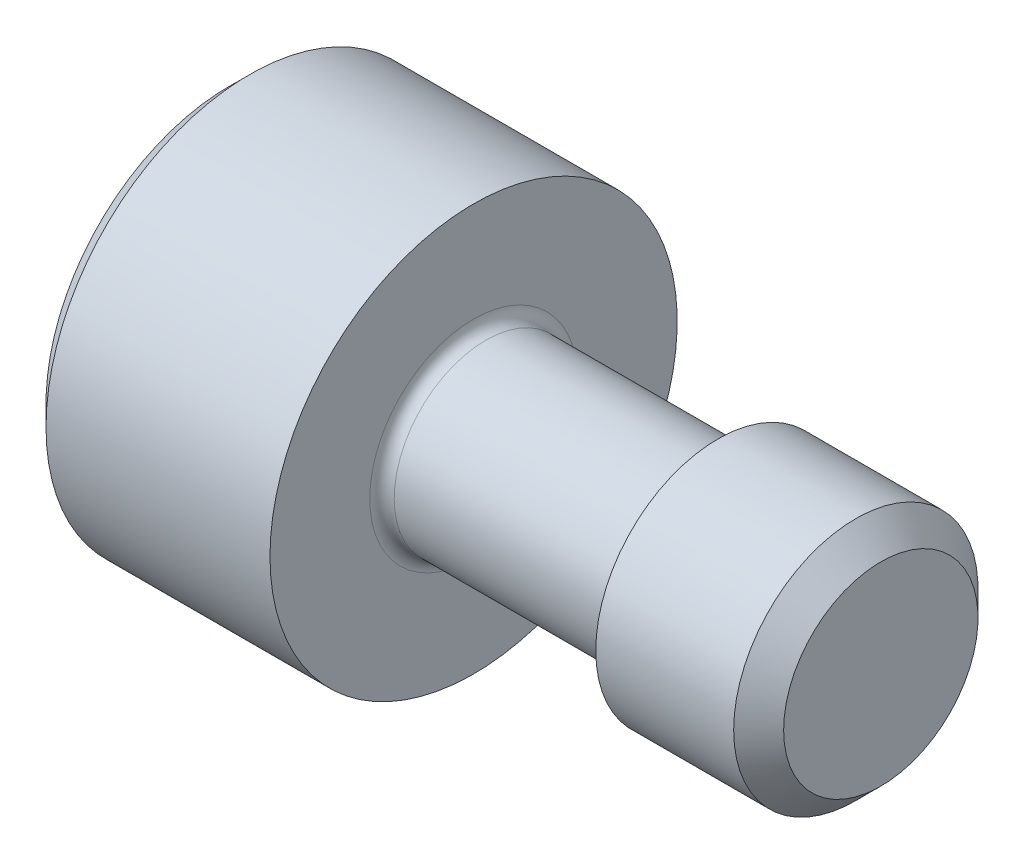
ISO-10303-21;
HEADER;
FILE_DESCRIPTION(('STEP AP214'),'2;1');
FILE_NAME('part.step','',(''),(''),'','','');
FILE_SCHEMA(('AUTOMOTIVE_DESIGN { 1 0 10303 214 1 1 1 1 }'));
ENDSEC;
DATA;
#1=APPLICATION_CONTEXT('core data for automotive mechanical design processes');
#2=APPLICATION_PROTOCOL_DEFINITION('international standard','automotive_design',2000,#1);
#3=PRODUCT_CONTEXT('',#1,'mechanical');
#4=PRODUCT('Part','Part','',(#3));
#5=PRODUCT_RELATED_PRODUCT_CATEGORY('part','',(#4));
#6=PRODUCT_DEFINITION_FORMATION('','',#4);
#7=PRODUCT_DEFINITION_CONTEXT('part definition',#1,'design');
#8=PRODUCT_DEFINITION('design','',#6,#7);
#9=PRODUCT_DEFINITION_SHAPE('','',#8);
#10=(LENGTH_UNIT() NAMED_UNIT(*) SI_UNIT(.MILLI.,.METRE.));
#11=(NAMED_UNIT(*) PLANE_ANGLE_UNIT() SI_UNIT($,.RADIAN.));
#12=(NAMED_UNIT(*) SI_UNIT($,.STERADIAN.) SOLID_ANGLE_UNIT());
#13=UNCERTAINTY_MEASURE_WITH_UNIT(LENGTH_MEASURE(1.E-05),#10,'distance_accuracy_value','');
#14=(GEOMETRIC_REPRESENTATION_CONTEXT(3) GLOBAL_UNCERTAINTY_ASSIGNED_CONTEXT((#13)) GLOBAL_UNIT_ASSIGNED_CONTEXT((#10,
#11,#12)) REPRESENTATION_CONTEXT('',''));
#15=CARTESIAN_POINT('',(0.,0.,0.));
#16=DIRECTION('',(0.,0.,1.));
#17=DIRECTION('',(1.,0.,0.));
#18=AXIS2_PLACEMENT_3D('',#15,#16,#17);
#19=CARTESIAN_POINT('',(10.,2.3865,0.));
#20=DIRECTION('',(-1.,0.,0.));
#21=DIRECTION('',(0.,0.,1.));
#22=AXIS2_PLACEMENT_3D('',#19,#20,#21);
#23=PLANE('',#22);
#24=CARTESIAN_POINT('',(9.99999999993406,0.,0.));
#25=DIRECTION('',(-1.,0.,0.));
#26=DIRECTION('',(0.,0.,1.));
#27=AXIS2_PLACEMENT_3D('',#24,#25,#26);
#28=CIRCLE('',#27,2.38650000005691);
#29=CARTESIAN_POINT('',(9.99999999993406,0.,2.38650000005691));
#30=VERTEX_POINT('',#29);
#31=EDGE_CURVE('E144',#30,#30,#28,.T.);
#32=ORIENTED_EDGE('',*,*,#31,.F.);
#33=EDGE_LOOP('',(#32));
#34=FACE_BOUND('',#33,.T.);
#35=ADVANCED_FACE('F17',(#34),#23,.F.);
#36=CARTESIAN_POINT('',(-3.,0.,0.));
#37=DIRECTION('',(1.,0.,0.));
#38=DIRECTION('',(0.,0.,-1.));
#39=AXIS2_PLACEMENT_3D('',#36,#37,#38);
#40=PLANE('',#39);
#41=DIRECTION('',(0.,1.,0.));
#42=VECTOR('',#41,1.);
#43=CARTESIAN_POINT('',(-3.,0.,2.49999999999868));
#44=LINE('',#43,#42);
#45=CARTESIAN_POINT('',(-3.00000000002137,0.,2.49999999999934));
#46=VERTEX_POINT('',#45);
#47=CARTESIAN_POINT('',(-3.00000000000025,-1.44337567297457,2.49999999999912));
#48=VERTEX_POINT('',#47);
#49=EDGE_CURVE('E80',#46,#48,#44,.F.);
#50=ORIENTED_EDGE('',*,*,#49,.F.);
#51=CARTESIAN_POINT('',(-3.00000000004275,0.,0.));
#52=DIRECTION('',(-1.,0.,0.));
#53=DIRECTION('',(0.,-1.,0.));
#54=AXIS2_PLACEMENT_3D('',#51,#52,#53);
#55=CIRCLE('',#54,2.49999999999773);
#56=CARTESIAN_POINT('',(-3.00000000002137,-2.1650635094588,1.24999999999339));
#57=VERTEX_POINT('',#56);
#58=EDGE_CURVE('E83',#46,#57,#55,.F.);
#59=ORIENTED_EDGE('',*,*,#58,.T.);
#60=DIRECTION('',(0.,-0.499999999996825,-0.866025403786272));
#61=VECTOR('',#60,1.);
#62=CARTESIAN_POINT('',(-3.,-1.44337567297406,2.5));
#63=LINE('',#62,#61);
#64=EDGE_CURVE('E86',#48,#57,#63,.T.);
#65=ORIENTED_EDGE('',*,*,#64,.F.);
#66=EDGE_LOOP('',(#50,#59,#65));
#67=FACE_BOUND('',#66,.T.);
#68=ADVANCED_FACE('F82',(#67),#40,.F.);
#69=CARTESIAN_POINT('',(-3.,0.,0.));
#70=DIRECTION('',(1.,0.,0.));
#71=DIRECTION('',(0.,0.,-1.));
#72=AXIS2_PLACEMENT_3D('',#69,#70,#71);
#73=PLANE('',#72);
#74=DIRECTION('',(0.,-0.500000000003177,-0.866025403782604));
#75=VECTOR('',#74,1.);
#76=CARTESIAN_POINT('',(-3.,-2.1650635094565,1.24999999999737));
#77=LINE('',#76,#75);
#78=CARTESIAN_POINT('',(-3.,-2.88675134594813,0.));
#79=VERTEX_POINT('',#78);
#80=EDGE_CURVE('E167',#57,#79,#77,.T.);
#81=ORIENTED_EDGE('',*,*,#80,.F.);
#82=CARTESIAN_POINT('',(-3.00000000004275,0.,0.));
#83=DIRECTION('',(-1.,0.,0.));
#84=DIRECTION('',(0.,-1.,0.));
#85=AXIS2_PLACEMENT_3D('',#82,#83,#84);
#86=CIRCLE('',#85,2.49999999999773);
#87=CARTESIAN_POINT('',(-3.00000000002137,-2.16506350946012,-1.24999999999942));
#88=VERTEX_POINT('',#87);
#89=EDGE_CURVE('E103',#57,#88,#86,.F.);
#90=ORIENTED_EDGE('',*,*,#89,.T.);
#91=DIRECTION('',(0.,0.500000000000003,-0.866025403784437));
#92=VECTOR('',#91,1.);
#93=CARTESIAN_POINT('',(-3.,-2.88675134594813,0.));
#94=LINE('',#93,#92);
#95=EDGE_CURVE('E163',#79,#88,#94,.T.);
#96=ORIENTED_EDGE('',*,*,#95,.F.);
#97=EDGE_LOOP('',(#81,#90,#96));
#98=FACE_BOUND('',#97,.T.);
#99=ADVANCED_FACE('F222',(#98),#73,.F.);
#100=CARTESIAN_POINT('',(-3.,0.,0.));
#101=DIRECTION('',(1.,0.,0.));
#102=DIRECTION('',(0.,0.,-1.));
#103=AXIS2_PLACEMENT_3D('',#100,#101,#102);
#104=PLANE('',#103);
#105=DIRECTION('',(0.,0.499999999999996,-0.866025403784441));
#106=VECTOR('',#105,1.);
#107=CARTESIAN_POINT('',(-3.,-2.1650635094611,-1.24999999999999));
#108=LINE('',#107,#106);
#109=CARTESIAN_POINT('',(-3.,-1.44337567297407,-2.5));
#110=VERTEX_POINT('',#109);
#111=EDGE_CURVE('E159',#88,#110,#108,.T.);
#112=ORIENTED_EDGE('',*,*,#111,.F.);
#113=CARTESIAN_POINT('',(-3.00000000004275,0.,0.));
#114=DIRECTION('',(-1.,0.,0.));
#115=DIRECTION('',(0.,-1.,0.));
#116=AXIS2_PLACEMENT_3D('',#113,#114,#115);
#117=CIRCLE('',#116,2.49999999999773);
#118=CARTESIAN_POINT('',(-3.00000000002137,0.,-2.49999999999934));
#119=VERTEX_POINT('',#118);
#120=EDGE_CURVE('E136',#88,#119,#117,.F.);
#121=ORIENTED_EDGE('',*,*,#120,.T.);
#122=DIRECTION('',(0.,1.,0.));
#123=VECTOR('',#122,1.);
#124=CARTESIAN_POINT('',(-3.,0.,-2.5));
#125=LINE('',#124,#123);
#126=EDGE_CURVE('E157',#110,#119,#125,.T.);
#127=ORIENTED_EDGE('',*,*,#126,.F.);
#128=EDGE_LOOP('',(#112,#121,#127));
#129=FACE_BOUND('',#128,.T.);
#130=ADVANCED_FACE('F337',(#129),#104,.F.);
#131=CARTESIAN_POINT('',(9.38650000006191,0.,0.));
#132=DIRECTION('',(-1.,0.,0.));
#133=DIRECTION('',(0.,0.,1.));
#134=AXIS2_PLACEMENT_3D('',#131,#132,#133);
#135=CONICAL_SURFACE('',#134,2.99999999992906,0.785398163397448);
#136=CARTESIAN_POINT('',(9.3865,0.,0.));
#137=DIRECTION('',(-1.,0.,0.));
#138=DIRECTION('',(0.,0.,1.));
#139=AXIS2_PLACEMENT_3D('',#136,#137,#138);
#140=CIRCLE('',#139,3.);
#141=CARTESIAN_POINT('',(9.3865,0.,3.));
#142=VERTEX_POINT('',#141);
#143=EDGE_CURVE('E131',#142,#142,#140,.T.);
#144=ORIENTED_EDGE('',*,*,#143,.F.);
#145=EDGE_LOOP('',(#144));
#146=FACE_BOUND('',#145,.T.);
#147=ORIENTED_EDGE('',*,*,#31,.T.);
#148=EDGE_LOOP('',(#147));
#149=FACE_BOUND('',#148,.T.);
#150=ADVANCED_FACE('F215',(#146,#149),#135,.T.);
#151=CARTESIAN_POINT('',(-3.,0.,0.));
#152=DIRECTION('',(1.,0.,0.));
#153=DIRECTION('',(0.,0.,-1.));
#154=AXIS2_PLACEMENT_3D('',#151,#152,#153);
#155=PLANE('',#154);
#156=DIRECTION('',(0.,0.500000000000001,0.866025403784438));
#157=VECTOR('',#156,1.);
#158=CARTESIAN_POINT('',(-3.,2.16506350946111,-1.24999999999997));
#159=LINE('',#158,#157);
#160=CARTESIAN_POINT('',(-3.00000000002137,2.16506350946013,-1.2499999999994));
#161=VERTEX_POINT('',#160);
#162=CARTESIAN_POINT('',(-3.,2.88675134594813,0.));
#163=VERTEX_POINT('',#162);
#164=EDGE_CURVE('E140',#161,#163,#159,.T.);
#165=ORIENTED_EDGE('',*,*,#164,.F.);
#166=CARTESIAN_POINT('',(-3.00000000004275,0.,0.));
#167=DIRECTION('',(-1.,0.,0.));
#168=DIRECTION('',(0.,-1.,0.));
#169=AXIS2_PLACEMENT_3D('',#166,#167,#168);
#170=CIRCLE('',#169,2.49999999999773);
#171=CARTESIAN_POINT('',(-3.00000000002137,2.16506350945422,1.25000000000133));
#172=VERTEX_POINT('',#171);
#173=EDGE_CURVE('E149',#161,#172,#170,.F.);
#174=ORIENTED_EDGE('',*,*,#173,.T.);
#175=DIRECTION('',(0.,-0.500000000003177,0.866025403782604));
#176=VECTOR('',#175,1.);
#177=CARTESIAN_POINT('',(-3.,2.88675134594813,0.));
#178=LINE('',#177,#176);
#179=EDGE_CURVE('E104',#163,#172,#178,.T.);
#180=ORIENTED_EDGE('',*,*,#179,.F.);
#181=EDGE_LOOP('',(#165,#174,#180));
#182=FACE_BOUND('',#181,.T.);
#183=ADVANCED_FACE('F328',(#182),#155,.F.);
#184=CARTESIAN_POINT('',(-3.,0.,0.));
#185=DIRECTION('',(1.,0.,0.));
#186=DIRECTION('',(0.,0.,-1.));
#187=AXIS2_PLACEMENT_3D('',#184,#185,#186);
#188=PLANE('',#187);
#189=DIRECTION('',(0.,1.,0.));
#190=VECTOR('',#189,1.);
#191=CARTESIAN_POINT('',(-3.,0.,-2.49999999999868));
#192=LINE('',#191,#190);
#193=CARTESIAN_POINT('',(-3.,1.44337567297457,-2.49999999999912));
#194=VERTEX_POINT('',#193);
#195=EDGE_CURVE('E132',#119,#194,#192,.T.);
#196=ORIENTED_EDGE('',*,*,#195,.F.);
#197=CARTESIAN_POINT('',(-3.00000000004275,0.,0.));
#198=DIRECTION('',(-1.,0.,0.));
#199=DIRECTION('',(0.,-1.,0.));
#200=AXIS2_PLACEMENT_3D('',#197,#198,#199);
#201=CIRCLE('',#200,2.49999999999773);
#202=EDGE_CURVE('E204',#119,#161,#201,.F.);
#203=ORIENTED_EDGE('',*,*,#202,.T.);
#204=DIRECTION('',(0.,0.5,0.866025403784438));
#205=VECTOR('',#204,1.);
#206=CARTESIAN_POINT('',(-3.,1.44337567297406,-2.5));
#207=LINE('',#206,#205);
#208=EDGE_CURVE('E129',#194,#161,#207,.T.);
#209=ORIENTED_EDGE('',*,*,#208,.F.);
#210=EDGE_LOOP('',(#196,#203,#209));
#211=FACE_BOUND('',#210,.T.);
#212=ADVANCED_FACE('F324',(#211),#188,.F.);
#213=CARTESIAN_POINT('',(10.,0.,0.));
#214=DIRECTION('',(-1.,0.,0.));
#215=DIRECTION('',(0.,0.,1.));
#216=AXIS2_PLACEMENT_3D('',#213,#214,#215);
#217=CYLINDRICAL_SURFACE('',#216,3.);
#218=ORIENTED_EDGE('',*,*,#143,.T.);
#219=EDGE_LOOP('',(#218));
#220=FACE_BOUND('',#219,.T.);
#221=CARTESIAN_POINT('',(6.,0.,0.));
#222=DIRECTION('',(-1.,0.,0.));
#223=DIRECTION('',(0.,0.,1.));
#224=AXIS2_PLACEMENT_3D('',#221,#222,#223);
#225=CIRCLE('',#224,3.);
#226=CARTESIAN_POINT('',(6.,0.,3.));
#227=VERTEX_POINT('',#226);
#228=EDGE_CURVE('E113',#227,#227,#225,.F.);
#229=ORIENTED_EDGE('',*,*,#228,.T.);
#230=EDGE_LOOP('',(#229));
#231=FACE_BOUND('',#230,.T.);
#232=ADVANCED_FACE('F335',(#220,#231),#217,.T.);
#233=CARTESIAN_POINT('',(-3.00000000004275,0.,0.));
#234=DIRECTION('',(-1.,0.,0.));
#235=DIRECTION('',(0.,-1.,0.));
#236=AXIS2_PLACEMENT_3D('',#233,#234,#235);
#237=CONICAL_SURFACE('',#236,2.49999999999773,1.0471975511585);
#238=CARTESIAN_POINT('',(-1.55662432709391,0.,5.6843418860808E-11));
#239=VERTEX_POINT('',#238);
#240=VERTEX_LOOP('',#239);
#241=FACE_BOUND('',#240,.T.);
#242=ORIENTED_EDGE('',*,*,#202,.F.);
#243=ORIENTED_EDGE('',*,*,#120,.F.);
#244=ORIENTED_EDGE('',*,*,#89,.F.);
#245=ORIENTED_EDGE('',*,*,#58,.F.);
#246=CARTESIAN_POINT('',(-3.00000000004275,0.,0.));
#247=DIRECTION('',(-1.,0.,0.));
#248=DIRECTION('',(0.,-1.,0.));
#249=AXIS2_PLACEMENT_3D('',#246,#247,#248);
#250=CIRCLE('',#249,2.49999999999773);
#251=EDGE_CURVE('E99',#46,#172,#250,.T.);
#252=ORIENTED_EDGE('',*,*,#251,.T.);
#253=ORIENTED_EDGE('',*,*,#173,.F.);
#254=EDGE_LOOP('',(#242,#243,#244,#245,#252,#253));
#255=FACE_BOUND('',#254,.T.);
#256=ADVANCED_FACE('F97',(#241,#255),#237,.F.);
#257=CARTESIAN_POINT('',(6.,2.25,0.));
#258=DIRECTION('',(1.,0.,0.));
#259=DIRECTION('',(0.,0.,-1.));
#260=AXIS2_PLACEMENT_3D('',#257,#258,#259);
#261=PLANE('',#260);
#262=CARTESIAN_POINT('',(6.,0.,0.));
#263=DIRECTION('',(-1.,0.,0.));
#264=DIRECTION('',(0.,0.,1.));
#265=AXIS2_PLACEMENT_3D('',#262,#263,#264);
#266=CIRCLE('',#265,2.25);
#267=CARTESIAN_POINT('',(6.,0.,2.25));
#268=VERTEX_POINT('',#267);
#269=EDGE_CURVE('E112',#268,#268,#266,.T.);
#270=ORIENTED_EDGE('',*,*,#269,.F.);
#271=EDGE_LOOP('',(#270));
#272=FACE_BOUND('',#271,.T.);
#273=ORIENTED_EDGE('',*,*,#228,.F.);
#274=EDGE_LOOP('',(#273));
#275=FACE_BOUND('',#274,.T.);
#276=ADVANCED_FACE('F376',(#272,#275),#261,.F.);
#277=CARTESIAN_POINT('',(-3.,0.,0.));
#278=DIRECTION('',(1.,0.,0.));
#279=DIRECTION('',(0.,0.,-1.));
#280=AXIS2_PLACEMENT_3D('',#277,#278,#279);
#281=PLANE('',#280);
#282=DIRECTION('',(0.,0.5,-0.866025403784439));
#283=VECTOR('',#282,1.);
#284=CARTESIAN_POINT('',(-3.,2.88675134594813,0.));
#285=LINE('',#284,#283);
#286=CARTESIAN_POINT('',(-3.,1.44337567297407,2.5));
#287=VERTEX_POINT('',#286);
#288=EDGE_CURVE('E111',#172,#287,#285,.F.);
#289=ORIENTED_EDGE('',*,*,#288,.F.);
#290=ORIENTED_EDGE('',*,*,#251,.F.);
#291=DIRECTION('',(0.,1.,0.));
#292=VECTOR('',#291,1.);
#293=CARTESIAN_POINT('',(-3.,1.44337567297406,2.5));
#294=LINE('',#293,#292);
#295=EDGE_CURVE('E108',#287,#46,#294,.F.);
#296=ORIENTED_EDGE('',*,*,#295,.F.);
#297=EDGE_LOOP('',(#289,#290,#296));
#298=FACE_BOUND('',#297,.T.);
#299=ADVANCED_FACE('F107',(#298),#281,.F.);
#300=CARTESIAN_POINT('',(10.,0.,0.));
#301=DIRECTION('',(-1.,0.,0.));
#302=DIRECTION('',(0.,0.,1.));
#303=AXIS2_PLACEMENT_3D('',#300,#301,#302);
#304=CYLINDRICAL_SURFACE('',#303,2.25);
#305=CARTESIAN_POINT('',(0.300000000000001,0.,0.));
#306=DIRECTION('',(1.,0.,0.));
#307=DIRECTION('',(0.,0.,-1.));
#308=AXIS2_PLACEMENT_3D('',#305,#306,#307);
#309=CIRCLE('',#308,2.25);
#310=CARTESIAN_POINT('',(0.300000000000001,0.,-2.25));
#311=VERTEX_POINT('',#310);
#312=EDGE_CURVE('E193',#311,#311,#309,.T.);
#313=ORIENTED_EDGE('',*,*,#312,.T.);
#314=EDGE_LOOP('',(#313));
#315=FACE_BOUND('',#314,.T.);
#316=ORIENTED_EDGE('',*,*,#269,.T.);
#317=EDGE_LOOP('',(#316));
#318=FACE_BOUND('',#317,.T.);
#319=ADVANCED_FACE('F370',(#315,#318),#304,.T.);
#320=CARTESIAN_POINT('',(-3.,1.44337567297406,2.5));
#321=DIRECTION('',(0.,0.,-1.));
#322=DIRECTION('',(-1.,0.,0.));
#323=AXIS2_PLACEMENT_3D('',#320,#321,#322);
#324=PLANE('',#323);
#325=DIRECTION('',(0.,1.,0.));
#326=VECTOR('',#325,1.);
#327=CARTESIAN_POINT('',(-6.,2.5,2.5));
#328=LINE('',#327,#326);
#329=CARTESIAN_POINT('',(-6.,-1.44337567297406,2.5));
#330=VERTEX_POINT('',#329);
#331=CARTESIAN_POINT('',(-6.,1.44337567297407,2.5));
#332=VERTEX_POINT('',#331);
#333=EDGE_CURVE('E276',#330,#332,#328,.T.);
#334=ORIENTED_EDGE('',*,*,#333,.T.);
#335=DIRECTION('',(1.,0.,0.));
#336=VECTOR('',#335,1.);
#337=CARTESIAN_POINT('',(-3.,1.44337567297407,2.5));
#338=LINE('',#337,#336);
#339=EDGE_CURVE('E118',#287,#332,#338,.F.);
#340=ORIENTED_EDGE('',*,*,#339,.F.);
#341=ORIENTED_EDGE('',*,*,#295,.T.);
#342=ORIENTED_EDGE('',*,*,#49,.T.);
#343=DIRECTION('',(1.,0.,0.));
#344=VECTOR('',#343,1.);
#345=CARTESIAN_POINT('',(-3.,-1.44337567297406,2.5));
#346=LINE('',#345,#344);
#347=EDGE_CURVE('E189',#330,#48,#346,.T.);
#348=ORIENTED_EDGE('',*,*,#347,.F.);
#349=EDGE_LOOP('',(#334,#340,#341,#342,#348));
#350=FACE_BOUND('',#349,.T.);
#351=ADVANCED_FACE('F116',(#350),#324,.T.);
#352=CARTESIAN_POINT('',(-3.,2.88675134594813,0.));
#353=DIRECTION('',(0.,-0.866025403784439,-0.5));
#354=DIRECTION('',(0.,0.5,-0.866025403784439));
#355=AXIS2_PLACEMENT_3D('',#352,#353,#354);
#356=PLANE('',#355);
#357=DIRECTION('',(0.,0.499999999999999,-0.866025403784439));
#358=VECTOR('',#357,1.);
#359=CARTESIAN_POINT('',(-6.,1.44337567297407,2.5));
#360=LINE('',#359,#358);
#361=CARTESIAN_POINT('',(-6.,2.88675134594813,0.));
#362=VERTEX_POINT('',#361);
#363=EDGE_CURVE('E273',#332,#362,#360,.T.);
#364=ORIENTED_EDGE('',*,*,#363,.T.);
#365=DIRECTION('',(1.,0.,0.));
#366=VECTOR('',#365,1.);
#367=CARTESIAN_POINT('',(-3.,2.88675134594813,0.));
#368=LINE('',#367,#366);
#369=EDGE_CURVE('E154',#163,#362,#368,.F.);
#370=ORIENTED_EDGE('',*,*,#369,.F.);
#371=ORIENTED_EDGE('',*,*,#179,.T.);
#372=ORIENTED_EDGE('',*,*,#288,.T.);
#373=ORIENTED_EDGE('',*,*,#339,.T.);
#374=EDGE_LOOP('',(#364,#370,#371,#372,#373));
#375=FACE_BOUND('',#374,.T.);
#376=ADVANCED_FACE('F302',(#375),#356,.T.);
#377=CARTESIAN_POINT('',(-3.,1.44337567297406,-2.5));
#378=DIRECTION('',(0.,-0.866025403784439,0.5));
#379=DIRECTION('',(0.,-0.5,-0.866025403784439));
#380=AXIS2_PLACEMENT_3D('',#377,#378,#379);
#381=PLANE('',#380);
#382=DIRECTION('',(0.,-0.500000000000001,-0.866025403784438));
#383=VECTOR('',#382,1.);
#384=CARTESIAN_POINT('',(-6.,2.88675134594813,0.));
#385=LINE('',#384,#383);
#386=CARTESIAN_POINT('',(-6.,1.44337567297406,-2.5));
#387=VERTEX_POINT('',#386);
#388=EDGE_CURVE('E270',#362,#387,#385,.T.);
#389=ORIENTED_EDGE('',*,*,#388,.T.);
#390=DIRECTION('',(1.,0.,0.));
#391=VECTOR('',#390,1.);
#392=CARTESIAN_POINT('',(-3.,1.44337567297406,-2.5));
#393=LINE('',#392,#391);
#394=EDGE_CURVE('E150',#194,#387,#393,.F.);
#395=ORIENTED_EDGE('',*,*,#394,.F.);
#396=ORIENTED_EDGE('',*,*,#208,.T.);
#397=ORIENTED_EDGE('',*,*,#164,.T.);
#398=ORIENTED_EDGE('',*,*,#369,.T.);
#399=EDGE_LOOP('',(#389,#395,#396,#397,#398));
#400=FACE_BOUND('',#399,.T.);
#401=ADVANCED_FACE('F314',(#400),#381,.T.);
#402=CARTESIAN_POINT('',(-3.,-1.44337567297406,-2.5));
#403=DIRECTION('',(0.,0.,1.));
#404=DIRECTION('',(1.,0.,0.));
#405=AXIS2_PLACEMENT_3D('',#402,#403,#404);
#406=PLANE('',#405);
#407=DIRECTION('',(0.,1.,0.));
#408=VECTOR('',#407,1.);
#409=CARTESIAN_POINT('',(-6.,2.5,-2.5));
#410=LINE('',#409,#408);
#411=CARTESIAN_POINT('',(-6.,-1.44337567297407,-2.5));
#412=VERTEX_POINT('',#411);
#413=EDGE_CURVE('E265',#387,#412,#410,.F.);
#414=ORIENTED_EDGE('',*,*,#413,.T.);
#415=DIRECTION('',(1.,0.,0.));
#416=VECTOR('',#415,1.);
#417=CARTESIAN_POINT('',(-3.,-1.44337567297407,-2.5));
#418=LINE('',#417,#416);
#419=EDGE_CURVE('E153',#110,#412,#418,.F.);
#420=ORIENTED_EDGE('',*,*,#419,.F.);
#421=ORIENTED_EDGE('',*,*,#126,.T.);
#422=ORIENTED_EDGE('',*,*,#195,.T.);
#423=ORIENTED_EDGE('',*,*,#394,.T.);
#424=EDGE_LOOP('',(#414,#420,#421,#422,#423));
#425=FACE_BOUND('',#424,.T.);
#426=ADVANCED_FACE('F319',(#425),#406,.T.);
#427=CARTESIAN_POINT('',(-3.,-2.88675134594813,0.));
#428=DIRECTION('',(0.,0.866025403784439,0.5));
#429=DIRECTION('',(0.,-0.5,0.866025403784439));
#430=AXIS2_PLACEMENT_3D('',#427,#428,#429);
#431=PLANE('',#430);
#432=DIRECTION('',(0.,-0.499999999999999,0.866025403784439));
#433=VECTOR('',#432,1.);
#434=CARTESIAN_POINT('',(-6.,-1.44337567297407,-2.5));
#435=LINE('',#434,#433);
#436=CARTESIAN_POINT('',(-6.,-2.88675134594813,0.));
#437=VERTEX_POINT('',#436);
#438=EDGE_CURVE('E260',#412,#437,#435,.T.);
#439=ORIENTED_EDGE('',*,*,#438,.T.);
#440=DIRECTION('',(1.,0.,0.));
#441=VECTOR('',#440,1.);
#442=CARTESIAN_POINT('',(-3.,-2.88675134594813,0.));
#443=LINE('',#442,#441);
#444=EDGE_CURVE('E184',#79,#437,#443,.F.);
#445=ORIENTED_EDGE('',*,*,#444,.F.);
#446=ORIENTED_EDGE('',*,*,#95,.T.);
#447=ORIENTED_EDGE('',*,*,#111,.T.);
#448=ORIENTED_EDGE('',*,*,#419,.T.);
#449=EDGE_LOOP('',(#439,#445,#446,#447,#448));
#450=FACE_BOUND('',#449,.T.);
#451=ADVANCED_FACE('F353',(#450),#431,.T.);
#452=CARTESIAN_POINT('',(-3.,-1.44337567297406,2.5));
#453=DIRECTION('',(0.,0.866025403784439,-0.5));
#454=DIRECTION('',(0.,0.5,0.866025403784439));
#455=AXIS2_PLACEMENT_3D('',#452,#453,#454);
#456=PLANE('',#455);
#457=DIRECTION('',(0.,0.500000000000001,0.866025403784438));
#458=VECTOR('',#457,1.);
#459=CARTESIAN_POINT('',(-6.,-2.88675134594813,0.));
#460=LINE('',#459,#458);
#461=EDGE_CURVE('E258',#437,#330,#460,.T.);
#462=ORIENTED_EDGE('',*,*,#461,.T.);
#463=ORIENTED_EDGE('',*,*,#347,.T.);
#464=ORIENTED_EDGE('',*,*,#64,.T.);
#465=ORIENTED_EDGE('',*,*,#80,.T.);
#466=ORIENTED_EDGE('',*,*,#444,.T.);
#467=EDGE_LOOP('',(#462,#463,#464,#465,#466));
#468=FACE_BOUND('',#467,.T.);
#469=ADVANCED_FACE('F284',(#468),#456,.T.);
#470=CARTESIAN_POINT('',(0.3,0.,0.));
#471=DIRECTION('',(1.,0.,0.));
#472=DIRECTION('',(0.,0.,-1.));
#473=AXIS2_PLACEMENT_3D('',#470,#471,#472);
#474=TOROIDAL_SURFACE('',#473,2.55,0.3);
#475=ORIENTED_EDGE('',*,*,#312,.F.);
#476=EDGE_LOOP('',(#475));
#477=FACE_BOUND('',#476,.T.);
#478=CARTESIAN_POINT('',(0.,0.,0.));
#479=DIRECTION('',(1.,0.,0.));
#480=DIRECTION('',(0.,0.,-1.));
#481=AXIS2_PLACEMENT_3D('',#478,#479,#480);
#482=CIRCLE('',#481,2.55);
#483=CARTESIAN_POINT('',(0.,0.,-2.55));
#484=VERTEX_POINT('',#483);
#485=CARTESIAN_POINT('',(0.,0.,2.55));
#486=VERTEX_POINT('',#485);
#487=EDGE_CURVE('E200',#484,#486,#482,.T.);
#488=ORIENTED_EDGE('',*,*,#487,.T.);
#489=CARTESIAN_POINT('',(0.,0.,0.));
#490=DIRECTION('',(1.,0.,0.));
#491=DIRECTION('',(0.,0.,1.));
#492=AXIS2_PLACEMENT_3D('',#489,#490,#491);
#493=CIRCLE('',#492,2.55);
#494=EDGE_CURVE('E36',#486,#484,#493,.T.);
#495=ORIENTED_EDGE('',*,*,#494,.T.);
#496=EDGE_LOOP('',(#488,#495));
#497=FACE_BOUND('',#496,.T.);
#498=ADVANCED_FACE('F280',(#477,#497),#474,.F.);
#499=CARTESIAN_POINT('',(-6.,2.5,0.));
#500=DIRECTION('',(1.,0.,0.));
#501=DIRECTION('',(0.,0.,-1.));
#502=AXIS2_PLACEMENT_3D('',#499,#500,#501);
#503=PLANE('',#502);
#504=ORIENTED_EDGE('',*,*,#438,.F.);
#505=ORIENTED_EDGE('',*,*,#413,.F.);
#506=ORIENTED_EDGE('',*,*,#388,.F.);
#507=ORIENTED_EDGE('',*,*,#363,.F.);
#508=ORIENTED_EDGE('',*,*,#333,.F.);
#509=ORIENTED_EDGE('',*,*,#461,.F.);
#510=EDGE_LOOP('',(#504,#505,#506,#507,#508,#509));
#511=FACE_BOUND('',#510,.T.);
#512=CARTESIAN_POINT('',(-6.00000000002865,0.,0.));
#513=DIRECTION('',(1.,0.,0.));
#514=DIRECTION('',(0.,0.,-1.));
#515=AXIS2_PLACEMENT_3D('',#512,#513,#514);
#516=CIRCLE('',#515,4.49999999995043);
#517=CARTESIAN_POINT('',(-6.00000000002865,0.,-4.49999999995043));
#518=VERTEX_POINT('',#517);
#519=EDGE_CURVE('E198',#518,#518,#516,.T.);
#520=ORIENTED_EDGE('',*,*,#519,.F.);
#521=EDGE_LOOP('',(#520));
#522=FACE_BOUND('',#521,.T.);
#523=ADVANCED_FACE('F239',(#511,#522),#503,.F.);
#524=CARTESIAN_POINT('',(0.,5.,0.));
#525=DIRECTION('',(-1.,0.,0.));
#526=DIRECTION('',(0.,0.,1.));
#527=AXIS2_PLACEMENT_3D('',#524,#525,#526);
#528=PLANE('',#527);
#529=ORIENTED_EDGE('',*,*,#494,.F.);
#530=ORIENTED_EDGE('',*,*,#487,.F.);
#531=EDGE_LOOP('',(#529,#530));
#532=FACE_BOUND('',#531,.T.);
#533=CARTESIAN_POINT('',(0.,0.,0.));
#534=DIRECTION('',(-1.,0.,0.));
#535=DIRECTION('',(0.,0.,1.));
#536=AXIS2_PLACEMENT_3D('',#533,#534,#535);
#537=CIRCLE('',#536,5.);
#538=CARTESIAN_POINT('',(0.,0.,5.));
#539=VERTEX_POINT('',#538);
#540=EDGE_CURVE('E28',#539,#539,#537,.T.);
#541=ORIENTED_EDGE('',*,*,#540,.F.);
#542=EDGE_LOOP('',(#541));
#543=FACE_BOUND('',#542,.T.);
#544=ADVANCED_FACE('F231',(#532,#543),#528,.F.);
#545=CARTESIAN_POINT('',(-5.50000000004047,0.,0.));
#546=DIRECTION('',(1.,0.,0.));
#547=DIRECTION('',(0.,0.,-1.));
#548=AXIS2_PLACEMENT_3D('',#545,#546,#547);
#549=CONICAL_SURFACE('',#548,4.99999999999545,0.785398163454292);
#550=ORIENTED_EDGE('',*,*,#519,.T.);
#551=EDGE_LOOP('',(#550));
#552=FACE_BOUND('',#551,.T.);
#553=CARTESIAN_POINT('',(-5.5,0.,0.));
#554=DIRECTION('',(-1.,0.,0.));
#555=DIRECTION('',(0.,0.,1.));
#556=AXIS2_PLACEMENT_3D('',#553,#554,#555);
#557=CIRCLE('',#556,5.);
#558=CARTESIAN_POINT('',(-5.5,0.,5.));
#559=VERTEX_POINT('',#558);
#560=EDGE_CURVE('E11',#559,#559,#557,.F.);
#561=ORIENTED_EDGE('',*,*,#560,.F.);
#562=EDGE_LOOP('',(#561));
#563=FACE_BOUND('',#562,.T.);
#564=ADVANCED_FACE('F225',(#552,#563),#549,.T.);
#565=CARTESIAN_POINT('',(10.,0.,0.));
#566=DIRECTION('',(-1.,0.,0.));
#567=DIRECTION('',(0.,0.,1.));
#568=AXIS2_PLACEMENT_3D('',#565,#566,#567);
#569=CYLINDRICAL_SURFACE('',#568,5.);
#570=ORIENTED_EDGE('',*,*,#560,.T.);
#571=EDGE_LOOP('',(#570));
#572=FACE_BOUND('',#571,.T.);
#573=ORIENTED_EDGE('',*,*,#540,.T.);
#574=EDGE_LOOP('',(#573));
#575=FACE_BOUND('',#574,.T.);
#576=ADVANCED_FACE('F223',(#572,#575),#569,.T.);
#577=CLOSED_SHELL('',(#35,#68,#99,#130,#150,#183,#212,#232,#256,#276,#299,#319,#351,#376,#401,
#426,#451,#469,#498,#523,#544,#564,#576));
#578=MANIFOLD_SOLID_BREP('B1',#577);
#579=ADVANCED_BREP_SHAPE_REPRESENTATION('',(#18,#578),#14);
#580=SHAPE_DEFINITION_REPRESENTATION(#9,#579);
ENDSEC;
END-ISO-10303-21;
